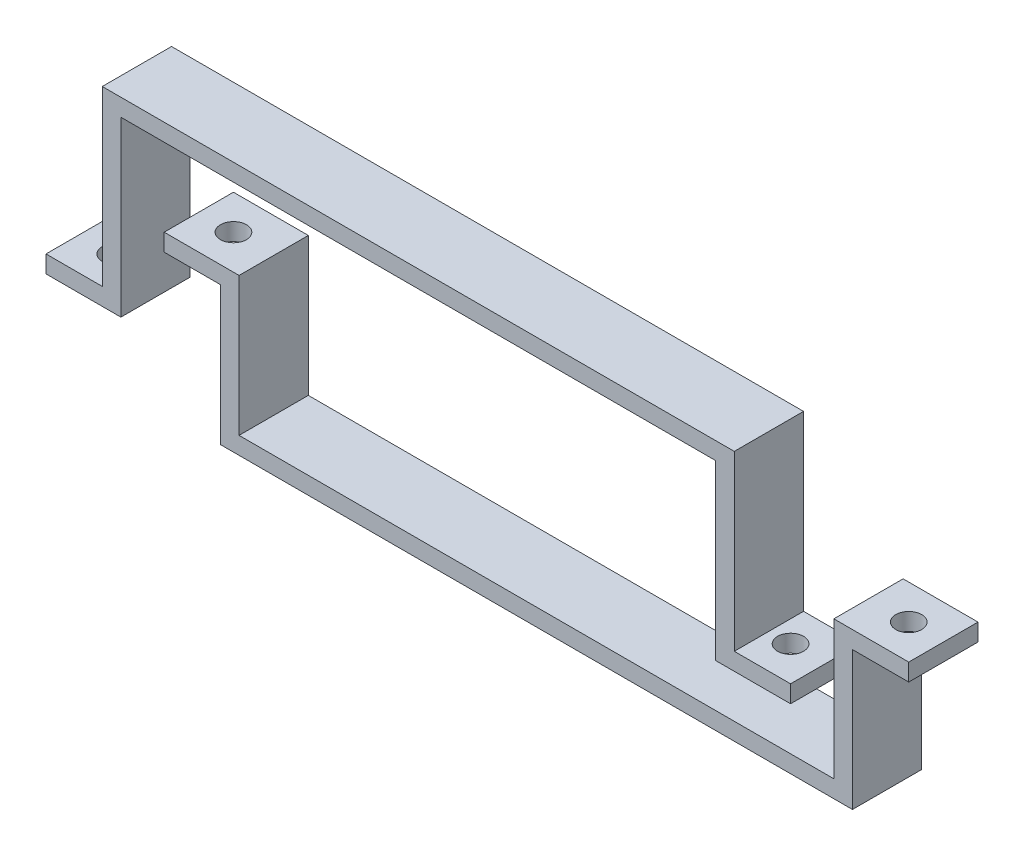
ISO-10303-21;
HEADER;
FILE_DESCRIPTION(('STEP AP214'),'2;1');
FILE_NAME('part.step','',(''),(''),'','','');
FILE_SCHEMA(('AUTOMOTIVE_DESIGN { 1 0 10303 214 1 1 1 1 }'));
ENDSEC;
DATA;
#1=APPLICATION_CONTEXT('core data for automotive mechanical design processes');
#2=APPLICATION_PROTOCOL_DEFINITION('international standard','automotive_design',2000,#1);
#3=PRODUCT_CONTEXT('',#1,'mechanical');
#4=PRODUCT('Part','Part','',(#3));
#5=PRODUCT_RELATED_PRODUCT_CATEGORY('part','',(#4));
#6=PRODUCT_DEFINITION_FORMATION('','',#4);
#7=PRODUCT_DEFINITION_CONTEXT('part definition',#1,'design');
#8=PRODUCT_DEFINITION('design','',#6,#7);
#9=PRODUCT_DEFINITION_SHAPE('','',#8);
#10=(LENGTH_UNIT() NAMED_UNIT(*) SI_UNIT(.MILLI.,.METRE.));
#11=(NAMED_UNIT(*) PLANE_ANGLE_UNIT() SI_UNIT($,.RADIAN.));
#12=(NAMED_UNIT(*) SI_UNIT($,.STERADIAN.) SOLID_ANGLE_UNIT());
#13=UNCERTAINTY_MEASURE_WITH_UNIT(LENGTH_MEASURE(1.E-05),#10,'distance_accuracy_value','');
#14=(GEOMETRIC_REPRESENTATION_CONTEXT(3) GLOBAL_UNCERTAINTY_ASSIGNED_CONTEXT((#13)) GLOBAL_UNIT_ASSIGNED_CONTEXT((#10,
#11,#12)) REPRESENTATION_CONTEXT('',''));
#15=CARTESIAN_POINT('',(0.,0.,0.));
#16=DIRECTION('',(0.,0.,1.));
#17=DIRECTION('',(1.,0.,0.));
#18=AXIS2_PLACEMENT_3D('',#15,#16,#17);
#19=CARTESIAN_POINT('',(-8.42045299834451,9.22574823310614,93.7490792128662));
#20=DIRECTION('',(0.,-1.,0.));
#21=DIRECTION('',(0.,0.,-1.));
#22=AXIS2_PLACEMENT_3D('',#19,#20,#21);
#23=PLANE('',#22);
#24=DIRECTION('',(1.,0.,0.));
#25=VECTOR('',#24,1.);
#26=CARTESIAN_POINT('',(-44.9204529983445,9.22574823310614,89.7490792128662));
#27=LINE('',#26,#25);
#28=CARTESIAN_POINT('',(-42.7704529983445,9.22574823310614,89.7490792128662));
#29=VERTEX_POINT('',#28);
#30=CARTESIAN_POINT('',(25.9295470016555,9.22574823310614,89.7490792128662));
#31=VERTEX_POINT('',#30);
#32=EDGE_CURVE('P0_E193',#29,#31,#27,.T.);
#33=ORIENTED_EDGE('',*,*,#32,.T.);
#34=DIRECTION('',(0.,0.,-1.));
#35=VECTOR('',#34,1.);
#36=CARTESIAN_POINT('',(25.9295470016555,9.22574823310614,93.7490792128662));
#37=LINE('',#36,#35);
#38=CARTESIAN_POINT('',(25.9295470016555,9.22574823310614,97.7490792128662));
#39=VERTEX_POINT('',#38);
#40=EDGE_CURVE('P0_E163',#39,#31,#37,.T.);
#41=ORIENTED_EDGE('',*,*,#40,.F.);
#42=DIRECTION('',(1.,0.,0.));
#43=VECTOR('',#42,1.);
#44=CARTESIAN_POINT('',(-44.9204529983445,9.22574823310614,97.7490792128662));
#45=LINE('',#44,#43);
#46=CARTESIAN_POINT('',(-42.7704529983445,9.22574823310614,97.7490792128662));
#47=VERTEX_POINT('',#46);
#48=EDGE_CURVE('P0_E200',#47,#39,#45,.T.);
#49=ORIENTED_EDGE('',*,*,#48,.F.);
#50=DIRECTION('',(0.,0.,1.));
#51=VECTOR('',#50,1.);
#52=CARTESIAN_POINT('',(-42.7704529983445,9.22574823310614,93.7490792128662));
#53=LINE('',#52,#51);
#54=EDGE_CURVE('P0_E178',#29,#47,#53,.T.);
#55=ORIENTED_EDGE('',*,*,#54,.F.);
#56=EDGE_LOOP('',(#33,#41,#49,#55));
#57=FACE_BOUND('',#56,.T.);
#58=ADVANCED_FACE('P0_F17',(#57),#23,.T.);
#59=CARTESIAN_POINT('',(-44.9204529983445,11.2257482331061,97.7490792128662));
#60=DIRECTION('',(-1.,0.,0.));
#61=DIRECTION('',(0.,0.,1.));
#62=AXIS2_PLACEMENT_3D('',#59,#60,#61);
#63=PLANE('',#62);
#64=DIRECTION('',(0.,0.,-1.));
#65=VECTOR('',#64,1.);
#66=CARTESIAN_POINT('',(-44.9204529983445,-8.77425176689386,93.7490792128662));
#67=LINE('',#66,#65);
#68=CARTESIAN_POINT('',(-44.9204529983445,-8.77425176689386,97.7490792128662));
#69=VERTEX_POINT('',#68);
#70=CARTESIAN_POINT('',(-44.9204529983445,-8.77425176689386,89.7490792128662));
#71=VERTEX_POINT('',#70);
#72=EDGE_CURVE('P0_E42',#69,#71,#67,.T.);
#73=ORIENTED_EDGE('',*,*,#72,.F.);
#74=DIRECTION('',(0.,-1.,0.));
#75=VECTOR('',#74,1.);
#76=CARTESIAN_POINT('',(-44.9204529983445,11.2257482331061,97.7490792128662));
#77=LINE('',#76,#75);
#78=CARTESIAN_POINT('',(-44.9204529983445,11.2257482331061,97.7490792128662));
#79=VERTEX_POINT('',#78);
#80=EDGE_CURVE('P0_E11',#79,#69,#77,.T.);
#81=ORIENTED_EDGE('',*,*,#80,.F.);
#82=DIRECTION('',(0.,0.,-1.));
#83=VECTOR('',#82,1.);
#84=CARTESIAN_POINT('',(-44.9204529983445,11.2257482331061,97.7490792128662));
#85=LINE('',#84,#83);
#86=CARTESIAN_POINT('',(-44.9204529983445,11.2257482331061,89.7490792128662));
#87=VERTEX_POINT('',#86);
#88=EDGE_CURVE('P0_E196',#79,#87,#85,.T.);
#89=ORIENTED_EDGE('',*,*,#88,.T.);
#90=DIRECTION('',(0.,-1.,0.));
#91=VECTOR('',#90,1.);
#92=CARTESIAN_POINT('',(-44.9204529983445,11.2257482331061,89.7490792128662));
#93=LINE('',#92,#91);
#94=EDGE_CURVE('P0_E21',#87,#71,#93,.T.);
#95=ORIENTED_EDGE('',*,*,#94,.T.);
#96=EDGE_LOOP('',(#73,#81,#89,#95));
#97=FACE_BOUND('',#96,.T.);
#98=ADVANCED_FACE('P0_F19',(#97),#63,.T.);
#99=CARTESIAN_POINT('',(-44.9204529983445,11.2257482331061,97.7490792128662));
#100=DIRECTION('',(0.,0.,-1.));
#101=DIRECTION('',(-1.,0.,0.));
#102=AXIS2_PLACEMENT_3D('',#99,#100,#101);
#103=PLANE('',#102);
#104=ORIENTED_EDGE('',*,*,#80,.T.);
#105=DIRECTION('',(1.,0.,0.));
#106=VECTOR('',#105,1.);
#107=CARTESIAN_POINT('',(-8.42045299834451,-8.77425176689386,97.7490792128662));
#108=LINE('',#107,#106);
#109=CARTESIAN_POINT('',(-51.4204529983445,-8.77425176689386,97.7490792128662));
#110=VERTEX_POINT('',#109);
#111=EDGE_CURVE('P0_E152',#110,#69,#108,.T.);
#112=ORIENTED_EDGE('',*,*,#111,.F.);
#113=DIRECTION('',(0.,-1.,0.));
#114=VECTOR('',#113,1.);
#115=CARTESIAN_POINT('',(-51.4204529983445,-8.77425176689386,97.7490792128662));
#116=LINE('',#115,#114);
#117=CARTESIAN_POINT('',(-51.4204529983445,-10.7742517668939,97.7490792128662));
#118=VERTEX_POINT('',#117);
#119=EDGE_CURVE('P0_E157',#110,#118,#116,.T.);
#120=ORIENTED_EDGE('',*,*,#119,.T.);
#121=DIRECTION('',(1.,0.,0.));
#122=VECTOR('',#121,1.);
#123=CARTESIAN_POINT('',(-8.42045299834451,-10.7742517668939,97.7490792128662));
#124=LINE('',#123,#122);
#125=CARTESIAN_POINT('',(-42.7704529983445,-10.7742517668939,97.7490792128662));
#126=VERTEX_POINT('',#125);
#127=EDGE_CURVE('P0_E184',#118,#126,#124,.T.);
#128=ORIENTED_EDGE('',*,*,#127,.T.);
#129=DIRECTION('',(0.,1.,0.));
#130=VECTOR('',#129,1.);
#131=CARTESIAN_POINT('',(-42.7704529983445,-10.7742517668939,97.7490792128662));
#132=LINE('',#131,#130);
#133=EDGE_CURVE('P0_E190',#126,#47,#132,.T.);
#134=ORIENTED_EDGE('',*,*,#133,.T.);
#135=ORIENTED_EDGE('',*,*,#48,.T.);
#136=DIRECTION('',(0.,1.,0.));
#137=VECTOR('',#136,1.);
#138=CARTESIAN_POINT('',(25.9295470016555,-10.7742517668939,97.7490792128662));
#139=LINE('',#138,#137);
#140=CARTESIAN_POINT('',(25.9295470016555,-10.7742517668939,97.7490792128662));
#141=VERTEX_POINT('',#140);
#142=EDGE_CURVE('P0_E173',#141,#39,#139,.T.);
#143=ORIENTED_EDGE('',*,*,#142,.F.);
#144=DIRECTION('',(1.,0.,0.));
#145=VECTOR('',#144,1.);
#146=CARTESIAN_POINT('',(-8.42045299834451,-10.7742517668939,97.7490792128662));
#147=LINE('',#146,#145);
#148=CARTESIAN_POINT('',(34.5795470016555,-10.7742517668939,97.7490792128662));
#149=VERTEX_POINT('',#148);
#150=EDGE_CURVE('P0_E169',#141,#149,#147,.T.);
#151=ORIENTED_EDGE('',*,*,#150,.T.);
#152=DIRECTION('',(0.,-1.,0.));
#153=VECTOR('',#152,1.);
#154=CARTESIAN_POINT('',(34.5795470016555,-8.77425176689386,97.7490792128662));
#155=LINE('',#154,#153);
#156=CARTESIAN_POINT('',(34.5795470016555,-8.77425176689386,97.7490792128662));
#157=VERTEX_POINT('',#156);
#158=EDGE_CURVE('P0_E122',#157,#149,#155,.T.);
#159=ORIENTED_EDGE('',*,*,#158,.F.);
#160=DIRECTION('',(1.,0.,0.));
#161=VECTOR('',#160,1.);
#162=CARTESIAN_POINT('',(-8.42045299834451,-8.77425176689386,97.7490792128662));
#163=LINE('',#162,#161);
#164=CARTESIAN_POINT('',(28.0795470016555,-8.77425176689386,97.7490792128662));
#165=VERTEX_POINT('',#164);
#166=EDGE_CURVE('P0_E110',#165,#157,#163,.T.);
#167=ORIENTED_EDGE('',*,*,#166,.F.);
#168=DIRECTION('',(0.,-1.,0.));
#169=VECTOR('',#168,1.);
#170=CARTESIAN_POINT('',(28.0795470016555,11.2257482331061,97.7490792128662));
#171=LINE('',#170,#169);
#172=CARTESIAN_POINT('',(28.0795470016555,11.2257482331061,97.7490792128662));
#173=VERTEX_POINT('',#172);
#174=EDGE_CURVE('P0_E26',#173,#165,#171,.T.);
#175=ORIENTED_EDGE('',*,*,#174,.F.);
#176=DIRECTION('',(1.,0.,0.));
#177=VECTOR('',#176,1.);
#178=CARTESIAN_POINT('',(-44.9204529983445,11.2257482331061,97.7490792128662));
#179=LINE('',#178,#177);
#180=EDGE_CURVE('P0_E204',#79,#173,#179,.T.);
#181=ORIENTED_EDGE('',*,*,#180,.F.);
#182=EDGE_LOOP('',(#104,#112,#120,#128,#134,#135,#143,#151,#159,#167,#175,#181));
#183=FACE_BOUND('',#182,.T.);
#184=ADVANCED_FACE('P0_F225',(#183),#103,.F.);
#185=CARTESIAN_POINT('',(28.0795470016555,11.2257482331061,97.7490792128662));
#186=DIRECTION('',(-1.,0.,0.));
#187=DIRECTION('',(0.,0.,1.));
#188=AXIS2_PLACEMENT_3D('',#185,#186,#187);
#189=PLANE('',#188);
#190=ORIENTED_EDGE('',*,*,#174,.T.);
#191=DIRECTION('',(0.,0.,-1.));
#192=VECTOR('',#191,1.);
#193=CARTESIAN_POINT('',(28.0795470016555,-8.77425176689386,93.7490792128662));
#194=LINE('',#193,#192);
#195=CARTESIAN_POINT('',(28.0795470016555,-8.77425176689386,89.7490792128662));
#196=VERTEX_POINT('',#195);
#197=EDGE_CURVE('P0_E123',#165,#196,#194,.T.);
#198=ORIENTED_EDGE('',*,*,#197,.T.);
#199=DIRECTION('',(0.,-1.,0.));
#200=VECTOR('',#199,1.);
#201=CARTESIAN_POINT('',(28.0795470016555,11.2257482331061,89.7490792128662));
#202=LINE('',#201,#200);
#203=CARTESIAN_POINT('',(28.0795470016555,11.2257482331061,89.7490792128662));
#204=VERTEX_POINT('',#203);
#205=EDGE_CURVE('P0_E130',#204,#196,#202,.T.);
#206=ORIENTED_EDGE('',*,*,#205,.F.);
#207=DIRECTION('',(0.,0.,-1.));
#208=VECTOR('',#207,1.);
#209=CARTESIAN_POINT('',(28.0795470016555,11.2257482331061,97.7490792128662));
#210=LINE('',#209,#208);
#211=EDGE_CURVE('P0_E202',#173,#204,#210,.T.);
#212=ORIENTED_EDGE('',*,*,#211,.F.);
#213=EDGE_LOOP('',(#190,#198,#206,#212));
#214=FACE_BOUND('',#213,.T.);
#215=ADVANCED_FACE('P0_F232',(#214),#189,.F.);
#216=CARTESIAN_POINT('',(-44.9204529983445,11.2257482331061,89.7490792128662));
#217=DIRECTION('',(0.,0.,-1.));
#218=DIRECTION('',(-1.,0.,0.));
#219=AXIS2_PLACEMENT_3D('',#216,#217,#218);
#220=PLANE('',#219);
#221=ORIENTED_EDGE('',*,*,#32,.F.);
#222=DIRECTION('',(0.,1.,0.));
#223=VECTOR('',#222,1.);
#224=CARTESIAN_POINT('',(-42.7704529983445,-10.7742517668939,89.7490792128662));
#225=LINE('',#224,#223);
#226=CARTESIAN_POINT('',(-42.7704529983445,-10.7742517668939,89.7490792128662));
#227=VERTEX_POINT('',#226);
#228=EDGE_CURVE('P0_E187',#227,#29,#225,.T.);
#229=ORIENTED_EDGE('',*,*,#228,.F.);
#230=DIRECTION('',(1.,0.,0.));
#231=VECTOR('',#230,1.);
#232=CARTESIAN_POINT('',(-8.42045299834451,-10.7742517668939,89.7490792128662));
#233=LINE('',#232,#231);
#234=CARTESIAN_POINT('',(-51.4204529983445,-10.7742517668939,89.7490792128662));
#235=VERTEX_POINT('',#234);
#236=EDGE_CURVE('P0_E182',#235,#227,#233,.T.);
#237=ORIENTED_EDGE('',*,*,#236,.F.);
#238=DIRECTION('',(0.,-1.,0.));
#239=VECTOR('',#238,1.);
#240=CARTESIAN_POINT('',(-51.4204529983445,-8.77425176689386,89.7490792128662));
#241=LINE('',#240,#239);
#242=CARTESIAN_POINT('',(-51.4204529983445,-8.77425176689386,89.7490792128662));
#243=VERTEX_POINT('',#242);
#244=EDGE_CURVE('P0_E160',#243,#235,#241,.T.);
#245=ORIENTED_EDGE('',*,*,#244,.F.);
#246=DIRECTION('',(1.,0.,0.));
#247=VECTOR('',#246,1.);
#248=CARTESIAN_POINT('',(-8.42045299834451,-8.77425176689386,89.7490792128662));
#249=LINE('',#248,#247);
#250=EDGE_CURVE('P0_E148',#243,#71,#249,.T.);
#251=ORIENTED_EDGE('',*,*,#250,.T.);
#252=ORIENTED_EDGE('',*,*,#94,.F.);
#253=DIRECTION('',(1.,0.,0.));
#254=VECTOR('',#253,1.);
#255=CARTESIAN_POINT('',(-44.9204529983445,11.2257482331061,89.7490792128662));
#256=LINE('',#255,#254);
#257=EDGE_CURVE('P0_E199',#87,#204,#256,.T.);
#258=ORIENTED_EDGE('',*,*,#257,.T.);
#259=ORIENTED_EDGE('',*,*,#205,.T.);
#260=DIRECTION('',(1.,0.,0.));
#261=VECTOR('',#260,1.);
#262=CARTESIAN_POINT('',(-8.42045299834451,-8.77425176689386,89.7490792128662));
#263=LINE('',#262,#261);
#264=CARTESIAN_POINT('',(34.5795470016555,-8.77425176689386,89.7490792128662));
#265=VERTEX_POINT('',#264);
#266=EDGE_CURVE('P0_E34',#196,#265,#263,.T.);
#267=ORIENTED_EDGE('',*,*,#266,.T.);
#268=DIRECTION('',(0.,-1.,0.));
#269=VECTOR('',#268,1.);
#270=CARTESIAN_POINT('',(34.5795470016555,-8.77425176689386,89.7490792128662));
#271=LINE('',#270,#269);
#272=CARTESIAN_POINT('',(34.5795470016555,-10.7742517668939,89.7490792128662));
#273=VERTEX_POINT('',#272);
#274=EDGE_CURVE('P0_E117',#265,#273,#271,.T.);
#275=ORIENTED_EDGE('',*,*,#274,.T.);
#276=DIRECTION('',(1.,0.,0.));
#277=VECTOR('',#276,1.);
#278=CARTESIAN_POINT('',(-8.42045299834451,-10.7742517668939,89.7490792128662));
#279=LINE('',#278,#277);
#280=CARTESIAN_POINT('',(25.9295470016555,-10.7742517668939,89.7490792128662));
#281=VERTEX_POINT('',#280);
#282=EDGE_CURVE('P0_E171',#281,#273,#279,.T.);
#283=ORIENTED_EDGE('',*,*,#282,.F.);
#284=DIRECTION('',(0.,1.,0.));
#285=VECTOR('',#284,1.);
#286=CARTESIAN_POINT('',(25.9295470016555,-10.7742517668939,89.7490792128662));
#287=LINE('',#286,#285);
#288=EDGE_CURVE('P0_E176',#281,#31,#287,.T.);
#289=ORIENTED_EDGE('',*,*,#288,.T.);
#290=EDGE_LOOP('',(#221,#229,#237,#245,#251,#252,#258,#259,#267,#275,#283,#289));
#291=FACE_BOUND('',#290,.T.);
#292=ADVANCED_FACE('P0_F127',(#291),#220,.T.);
#293=CARTESIAN_POINT('',(-8.42045299834451,11.2257482331061,93.7490792128662));
#294=DIRECTION('',(0.,-1.,0.));
#295=DIRECTION('',(0.,0.,-1.));
#296=AXIS2_PLACEMENT_3D('',#293,#294,#295);
#297=PLANE('',#296);
#298=ORIENTED_EDGE('',*,*,#88,.F.);
#299=ORIENTED_EDGE('',*,*,#180,.T.);
#300=ORIENTED_EDGE('',*,*,#211,.T.);
#301=ORIENTED_EDGE('',*,*,#257,.F.);
#302=EDGE_LOOP('',(#298,#299,#300,#301));
#303=FACE_BOUND('',#302,.T.);
#304=ADVANCED_FACE('P0_F230',(#303),#297,.F.);
#305=CARTESIAN_POINT('',(-42.7704529983445,-10.7742517668939,93.7490792128662));
#306=DIRECTION('',(-1.,0.,0.));
#307=DIRECTION('',(0.,0.,1.));
#308=AXIS2_PLACEMENT_3D('',#305,#306,#307);
#309=PLANE('',#308);
#310=ORIENTED_EDGE('',*,*,#54,.T.);
#311=ORIENTED_EDGE('',*,*,#133,.F.);
#312=DIRECTION('',(0.,0.,1.));
#313=VECTOR('',#312,1.);
#314=CARTESIAN_POINT('',(-42.7704529983445,-10.7742517668939,93.7490792128662));
#315=LINE('',#314,#313);
#316=EDGE_CURVE('P0_E180',#227,#126,#315,.T.);
#317=ORIENTED_EDGE('',*,*,#316,.F.);
#318=ORIENTED_EDGE('',*,*,#228,.T.);
#319=EDGE_LOOP('',(#310,#311,#317,#318));
#320=FACE_BOUND('',#319,.T.);
#321=ADVANCED_FACE('P0_F250',(#320),#309,.F.);
#322=CARTESIAN_POINT('',(-8.42045299834451,-10.7742517668939,93.7490792128662));
#323=DIRECTION('',(0.,1.,0.));
#324=DIRECTION('',(0.,0.,1.));
#325=AXIS2_PLACEMENT_3D('',#322,#323,#324);
#326=PLANE('',#325);
#327=ORIENTED_EDGE('',*,*,#316,.T.);
#328=ORIENTED_EDGE('',*,*,#127,.F.);
#329=DIRECTION('',(0.,0.,1.));
#330=VECTOR('',#329,1.);
#331=CARTESIAN_POINT('',(-51.4204529983445,-10.7742517668939,93.7490792128662));
#332=LINE('',#331,#330);
#333=EDGE_CURVE('P0_E145',#235,#118,#332,.T.);
#334=ORIENTED_EDGE('',*,*,#333,.F.);
#335=ORIENTED_EDGE('',*,*,#236,.T.);
#336=EDGE_LOOP('',(#327,#328,#334,#335));
#337=FACE_BOUND('',#336,.T.);
#338=CARTESIAN_POINT('',(-47.4204529983445,-10.7742517668939,93.7490792128662));
#339=DIRECTION('',(0.,1.,0.));
#340=DIRECTION('',(0.,0.,1.));
#341=AXIS2_PLACEMENT_3D('',#338,#339,#340);
#342=CIRCLE('',#341,1.5);
#343=CARTESIAN_POINT('',(-47.4204529983445,-10.7742517668939,95.2490792128662));
#344=VERTEX_POINT('',#343);
#345=EDGE_CURVE('P0_E140',#344,#344,#342,.T.);
#346=ORIENTED_EDGE('',*,*,#345,.T.);
#347=EDGE_LOOP('',(#346));
#348=FACE_BOUND('',#347,.T.);
#349=ADVANCED_FACE('P0_F253',(#337,#348),#326,.F.);
#350=CARTESIAN_POINT('',(25.9295470016555,-10.7742517668939,93.7490792128662));
#351=DIRECTION('',(1.,0.,0.));
#352=DIRECTION('',(0.,0.,-1.));
#353=AXIS2_PLACEMENT_3D('',#350,#351,#352);
#354=PLANE('',#353);
#355=ORIENTED_EDGE('',*,*,#40,.T.);
#356=ORIENTED_EDGE('',*,*,#288,.F.);
#357=DIRECTION('',(0.,0.,-1.));
#358=VECTOR('',#357,1.);
#359=CARTESIAN_POINT('',(25.9295470016555,-10.7742517668939,93.7490792128662));
#360=LINE('',#359,#358);
#361=EDGE_CURVE('P0_E166',#141,#281,#360,.T.);
#362=ORIENTED_EDGE('',*,*,#361,.F.);
#363=ORIENTED_EDGE('',*,*,#142,.T.);
#364=EDGE_LOOP('',(#355,#356,#362,#363));
#365=FACE_BOUND('',#364,.T.);
#366=ADVANCED_FACE('P0_F257',(#365),#354,.F.);
#367=CARTESIAN_POINT('',(-8.42045299834451,-10.7742517668939,93.7490792128662));
#368=DIRECTION('',(0.,1.,0.));
#369=DIRECTION('',(0.,0.,1.));
#370=AXIS2_PLACEMENT_3D('',#367,#368,#369);
#371=PLANE('',#370);
#372=ORIENTED_EDGE('',*,*,#361,.T.);
#373=ORIENTED_EDGE('',*,*,#282,.T.);
#374=DIRECTION('',(0.,0.,-1.));
#375=VECTOR('',#374,1.);
#376=CARTESIAN_POINT('',(34.5795470016555,-10.7742517668939,93.7490792128662));
#377=LINE('',#376,#375);
#378=EDGE_CURVE('P0_E120',#149,#273,#377,.T.);
#379=ORIENTED_EDGE('',*,*,#378,.F.);
#380=ORIENTED_EDGE('',*,*,#150,.F.);
#381=EDGE_LOOP('',(#372,#373,#379,#380));
#382=FACE_BOUND('',#381,.T.);
#383=CARTESIAN_POINT('',(30.5795470016555,-10.7742517668939,93.7490792128662));
#384=DIRECTION('',(0.,1.,0.));
#385=DIRECTION('',(0.,0.,1.));
#386=AXIS2_PLACEMENT_3D('',#383,#384,#385);
#387=CIRCLE('',#386,1.5);
#388=CARTESIAN_POINT('',(30.5795470016555,-10.7742517668939,95.2490792128662));
#389=VERTEX_POINT('',#388);
#390=EDGE_CURVE('P0_E135',#389,#389,#387,.T.);
#391=ORIENTED_EDGE('',*,*,#390,.T.);
#392=EDGE_LOOP('',(#391));
#393=FACE_BOUND('',#392,.T.);
#394=ADVANCED_FACE('P0_F261',(#382,#393),#371,.F.);
#395=CARTESIAN_POINT('',(-8.42045299834451,-8.77425176689386,93.7490792128662));
#396=DIRECTION('',(0.,1.,0.));
#397=DIRECTION('',(0.,0.,1.));
#398=AXIS2_PLACEMENT_3D('',#395,#396,#397);
#399=PLANE('',#398);
#400=ORIENTED_EDGE('',*,*,#250,.F.);
#401=DIRECTION('',(0.,0.,1.));
#402=VECTOR('',#401,1.);
#403=CARTESIAN_POINT('',(-51.4204529983445,-8.77425176689386,93.7490792128662));
#404=LINE('',#403,#402);
#405=EDGE_CURVE('P0_E155',#243,#110,#404,.T.);
#406=ORIENTED_EDGE('',*,*,#405,.T.);
#407=ORIENTED_EDGE('',*,*,#111,.T.);
#408=ORIENTED_EDGE('',*,*,#72,.T.);
#409=EDGE_LOOP('',(#400,#406,#407,#408));
#410=FACE_BOUND('',#409,.T.);
#411=CARTESIAN_POINT('',(-47.4204529983445,-8.77425176689386,93.7490792128662));
#412=DIRECTION('',(0.,1.,0.));
#413=DIRECTION('',(0.,0.,1.));
#414=AXIS2_PLACEMENT_3D('',#411,#412,#413);
#415=CIRCLE('',#414,1.5);
#416=CARTESIAN_POINT('',(-47.4204529983445,-8.77425176689386,95.2490792128662));
#417=VERTEX_POINT('',#416);
#418=EDGE_CURVE('P0_E142',#417,#417,#415,.T.);
#419=ORIENTED_EDGE('',*,*,#418,.F.);
#420=EDGE_LOOP('',(#419));
#421=FACE_BOUND('',#420,.T.);
#422=ADVANCED_FACE('P0_F215',(#410,#421),#399,.T.);
#423=CARTESIAN_POINT('',(-51.4204529983445,-8.77425176689386,93.7490792128662));
#424=DIRECTION('',(1.,0.,0.));
#425=DIRECTION('',(0.,0.,-1.));
#426=AXIS2_PLACEMENT_3D('',#423,#424,#425);
#427=PLANE('',#426);
#428=ORIENTED_EDGE('',*,*,#333,.T.);
#429=ORIENTED_EDGE('',*,*,#119,.F.);
#430=ORIENTED_EDGE('',*,*,#405,.F.);
#431=ORIENTED_EDGE('',*,*,#244,.T.);
#432=EDGE_LOOP('',(#428,#429,#430,#431));
#433=FACE_BOUND('',#432,.T.);
#434=ADVANCED_FACE('P0_F223',(#433),#427,.F.);
#435=CARTESIAN_POINT('',(-47.4204529983445,-8.77425176689386,93.7490792128662));
#436=DIRECTION('',(0.,-1.,0.));
#437=DIRECTION('',(0.,0.,-1.));
#438=AXIS2_PLACEMENT_3D('',#435,#436,#437);
#439=CYLINDRICAL_SURFACE('',#438,1.5);
#440=ORIENTED_EDGE('',*,*,#418,.T.);
#441=EDGE_LOOP('',(#440));
#442=FACE_BOUND('',#441,.T.);
#443=ORIENTED_EDGE('',*,*,#345,.F.);
#444=EDGE_LOOP('',(#443));
#445=FACE_BOUND('',#444,.T.);
#446=ADVANCED_FACE('P0_F268',(#442,#445),#439,.F.);
#447=CARTESIAN_POINT('',(-8.42045299834451,-8.77425176689386,93.7490792128662));
#448=DIRECTION('',(0.,1.,0.));
#449=DIRECTION('',(0.,0.,1.));
#450=AXIS2_PLACEMENT_3D('',#447,#448,#449);
#451=PLANE('',#450);
#452=ORIENTED_EDGE('',*,*,#266,.F.);
#453=ORIENTED_EDGE('',*,*,#197,.F.);
#454=ORIENTED_EDGE('',*,*,#166,.T.);
#455=DIRECTION('',(0.,0.,-1.));
#456=VECTOR('',#455,1.);
#457=CARTESIAN_POINT('',(34.5795470016555,-8.77425176689386,93.7490792128662));
#458=LINE('',#457,#456);
#459=EDGE_CURVE('P0_E106',#157,#265,#458,.T.);
#460=ORIENTED_EDGE('',*,*,#459,.T.);
#461=EDGE_LOOP('',(#452,#453,#454,#460));
#462=FACE_BOUND('',#461,.T.);
#463=CARTESIAN_POINT('',(30.5795470016555,-8.77425176689386,93.7490792128662));
#464=DIRECTION('',(0.,1.,0.));
#465=DIRECTION('',(0.,0.,1.));
#466=AXIS2_PLACEMENT_3D('',#463,#464,#465);
#467=CIRCLE('',#466,1.5);
#468=CARTESIAN_POINT('',(30.5795470016555,-8.77425176689386,95.2490792128662));
#469=VERTEX_POINT('',#468);
#470=EDGE_CURVE('P0_E132',#469,#469,#467,.T.);
#471=ORIENTED_EDGE('',*,*,#470,.F.);
#472=EDGE_LOOP('',(#471));
#473=FACE_BOUND('',#472,.T.);
#474=ADVANCED_FACE('P0_F108',(#462,#473),#451,.T.);
#475=CARTESIAN_POINT('',(34.5795470016555,-8.77425176689386,93.7490792128662));
#476=DIRECTION('',(-1.,0.,0.));
#477=DIRECTION('',(0.,0.,1.));
#478=AXIS2_PLACEMENT_3D('',#475,#476,#477);
#479=PLANE('',#478);
#480=ORIENTED_EDGE('',*,*,#378,.T.);
#481=ORIENTED_EDGE('',*,*,#274,.F.);
#482=ORIENTED_EDGE('',*,*,#459,.F.);
#483=ORIENTED_EDGE('',*,*,#158,.T.);
#484=EDGE_LOOP('',(#480,#481,#482,#483));
#485=FACE_BOUND('',#484,.T.);
#486=ADVANCED_FACE('P0_F118',(#485),#479,.F.);
#487=CARTESIAN_POINT('',(30.5795470016555,-8.77425176689386,93.7490792128662));
#488=DIRECTION('',(0.,-1.,0.));
#489=DIRECTION('',(0.,0.,-1.));
#490=AXIS2_PLACEMENT_3D('',#487,#488,#489);
#491=CYLINDRICAL_SURFACE('',#490,1.5);
#492=ORIENTED_EDGE('',*,*,#470,.T.);
#493=EDGE_LOOP('',(#492));
#494=FACE_BOUND('',#493,.T.);
#495=ORIENTED_EDGE('',*,*,#390,.F.);
#496=EDGE_LOOP('',(#495));
#497=FACE_BOUND('',#496,.T.);
#498=ADVANCED_FACE('P0_F276',(#494,#497),#491,.F.);
#499=CLOSED_SHELL('',(#58,#98,#184,#215,#292,#304,#321,#349,#366,#394,#422,#434,#446,#474,#486,#498));
#500=MANIFOLD_SOLID_BREP('P0_B1',#499);
#501=CARTESIAN_POINT('',(5.22954700165548,-15.7742517668939,93.7490792128662));
#502=DIRECTION('',(0.,1.,0.));
#503=DIRECTION('',(0.,0.,1.));
#504=AXIS2_PLACEMENT_3D('',#501,#502,#503);
#505=PLANE('',#504);
#506=DIRECTION('',(1.,0.,0.));
#507=VECTOR('',#506,1.);
#508=CARTESIAN_POINT('',(-31.2704529983445,-15.7742517668939,97.7490792128662));
#509=LINE('',#508,#507);
#510=CARTESIAN_POINT('',(-29.1204529983445,-15.7742517668939,97.7490792128662));
#511=VERTEX_POINT('',#510);
#512=CARTESIAN_POINT('',(39.5795470016555,-15.7742517668939,97.7490792128662));
#513=VERTEX_POINT('',#512);
#514=EDGE_CURVE('P1_E192',#511,#513,#509,.T.);
#515=ORIENTED_EDGE('',*,*,#514,.T.);
#516=DIRECTION('',(0.,0.,1.));
#517=VECTOR('',#516,1.);
#518=CARTESIAN_POINT('',(39.5795470016555,-15.7742517668939,93.7490792128662));
#519=LINE('',#518,#517);
#520=CARTESIAN_POINT('',(39.5795470016555,-15.7742517668939,89.7490792128662));
#521=VERTEX_POINT('',#520);
#522=EDGE_CURVE('P1_E162',#521,#513,#519,.T.);
#523=ORIENTED_EDGE('',*,*,#522,.F.);
#524=DIRECTION('',(1.,0.,0.));
#525=VECTOR('',#524,1.);
#526=CARTESIAN_POINT('',(-31.2704529983445,-15.7742517668939,89.7490792128662));
#527=LINE('',#526,#525);
#528=CARTESIAN_POINT('',(-29.1204529983445,-15.7742517668939,89.7490792128662));
#529=VERTEX_POINT('',#528);
#530=EDGE_CURVE('P1_E199',#529,#521,#527,.T.);
#531=ORIENTED_EDGE('',*,*,#530,.F.);
#532=DIRECTION('',(0.,0.,-1.));
#533=VECTOR('',#532,1.);
#534=CARTESIAN_POINT('',(-29.1204529983445,-15.7742517668939,93.7490792128662));
#535=LINE('',#534,#533);
#536=EDGE_CURVE('P1_E177',#511,#529,#535,.T.);
#537=ORIENTED_EDGE('',*,*,#536,.F.);
#538=EDGE_LOOP('',(#515,#523,#531,#537));
#539=FACE_BOUND('',#538,.T.);
#540=ADVANCED_FACE('P1_F16',(#539),#505,.T.);
#541=CARTESIAN_POINT('',(-31.2704529983445,-17.7742517668939,89.7490792128662));
#542=DIRECTION('',(-1.,0.,0.));
#543=DIRECTION('',(0.,0.,-1.));
#544=AXIS2_PLACEMENT_3D('',#541,#542,#543);
#545=PLANE('',#544);
#546=DIRECTION('',(0.,0.,1.));
#547=VECTOR('',#546,1.);
#548=CARTESIAN_POINT('',(-31.2704529983445,-1.77425176689386,93.7490792128662));
#549=LINE('',#548,#547);
#550=CARTESIAN_POINT('',(-31.2704529983445,-1.77425176689386,89.7490792128662));
#551=VERTEX_POINT('',#550);
#552=CARTESIAN_POINT('',(-31.2704529983445,-1.77425176689386,97.7490792128662));
#553=VERTEX_POINT('',#552);
#554=EDGE_CURVE('P1_E41',#551,#553,#549,.T.);
#555=ORIENTED_EDGE('',*,*,#554,.F.);
#556=DIRECTION('',(0.,1.,0.));
#557=VECTOR('',#556,1.);
#558=CARTESIAN_POINT('',(-31.2704529983445,-17.7742517668939,89.7490792128662));
#559=LINE('',#558,#557);
#560=CARTESIAN_POINT('',(-31.2704529983445,-17.7742517668939,89.7490792128662));
#561=VERTEX_POINT('',#560);
#562=EDGE_CURVE('P1_E10',#561,#551,#559,.T.);
#563=ORIENTED_EDGE('',*,*,#562,.F.);
#564=DIRECTION('',(0.,0.,1.));
#565=VECTOR('',#564,1.);
#566=CARTESIAN_POINT('',(-31.2704529983445,-17.7742517668939,89.7490792128662));
#567=LINE('',#566,#565);
#568=CARTESIAN_POINT('',(-31.2704529983445,-17.7742517668939,97.7490792128662));
#569=VERTEX_POINT('',#568);
#570=EDGE_CURVE('P1_E195',#561,#569,#567,.T.);
#571=ORIENTED_EDGE('',*,*,#570,.T.);
#572=DIRECTION('',(0.,1.,0.));
#573=VECTOR('',#572,1.);
#574=CARTESIAN_POINT('',(-31.2704529983445,-17.7742517668939,97.7490792128662));
#575=LINE('',#574,#573);
#576=EDGE_CURVE('P1_E20',#569,#553,#575,.T.);
#577=ORIENTED_EDGE('',*,*,#576,.T.);
#578=EDGE_LOOP('',(#555,#563,#571,#577));
#579=FACE_BOUND('',#578,.T.);
#580=ADVANCED_FACE('P1_F18',(#579),#545,.T.);
#581=CARTESIAN_POINT('',(-31.2704529983445,-17.7742517668939,89.7490792128662));
#582=DIRECTION('',(0.,0.,1.));
#583=DIRECTION('',(-1.,0.,0.));
#584=AXIS2_PLACEMENT_3D('',#581,#582,#583);
#585=PLANE('',#584);
#586=ORIENTED_EDGE('',*,*,#562,.T.);
#587=DIRECTION('',(1.,0.,0.));
#588=VECTOR('',#587,1.);
#589=CARTESIAN_POINT('',(5.22954700165548,-1.77425176689386,89.7490792128662));
#590=LINE('',#589,#588);
#591=CARTESIAN_POINT('',(-37.7704529983445,-1.77425176689385,89.7490792128662));
#592=VERTEX_POINT('',#591);
#593=EDGE_CURVE('P1_E151',#592,#551,#590,.T.);
#594=ORIENTED_EDGE('',*,*,#593,.F.);
#595=DIRECTION('',(0.,1.,0.));
#596=VECTOR('',#595,1.);
#597=CARTESIAN_POINT('',(-37.7704529983445,-1.77425176689385,89.7490792128662));
#598=LINE('',#597,#596);
#599=CARTESIAN_POINT('',(-37.7704529983445,0.225748233106143,89.7490792128662));
#600=VERTEX_POINT('',#599);
#601=EDGE_CURVE('P1_E156',#592,#600,#598,.T.);
#602=ORIENTED_EDGE('',*,*,#601,.T.);
#603=DIRECTION('',(1.,0.,0.));
#604=VECTOR('',#603,1.);
#605=CARTESIAN_POINT('',(5.22954700165548,0.22574823310614,89.7490792128662));
#606=LINE('',#605,#604);
#607=CARTESIAN_POINT('',(-29.1204529983445,0.225748233106143,89.7490792128662));
#608=VERTEX_POINT('',#607);
#609=EDGE_CURVE('P1_E183',#600,#608,#606,.T.);
#610=ORIENTED_EDGE('',*,*,#609,.T.);
#611=DIRECTION('',(0.,-1.,0.));
#612=VECTOR('',#611,1.);
#613=CARTESIAN_POINT('',(-29.1204529983445,0.225748233106143,89.7490792128662));
#614=LINE('',#613,#612);
#615=EDGE_CURVE('P1_E189',#608,#529,#614,.T.);
#616=ORIENTED_EDGE('',*,*,#615,.T.);
#617=ORIENTED_EDGE('',*,*,#530,.T.);
#618=DIRECTION('',(0.,-1.,0.));
#619=VECTOR('',#618,1.);
#620=CARTESIAN_POINT('',(39.5795470016555,0.225748233106136,89.7490792128662));
#621=LINE('',#620,#619);
#622=CARTESIAN_POINT('',(39.5795470016555,0.225748233106136,89.7490792128662));
#623=VERTEX_POINT('',#622);
#624=EDGE_CURVE('P1_E172',#623,#521,#621,.T.);
#625=ORIENTED_EDGE('',*,*,#624,.F.);
#626=DIRECTION('',(1.,0.,0.));
#627=VECTOR('',#626,1.);
#628=CARTESIAN_POINT('',(5.22954700165548,0.22574823310614,89.7490792128662));
#629=LINE('',#628,#627);
#630=CARTESIAN_POINT('',(48.2295470016555,0.225748233106136,89.7490792128662));
#631=VERTEX_POINT('',#630);
#632=EDGE_CURVE('P1_E168',#623,#631,#629,.T.);
#633=ORIENTED_EDGE('',*,*,#632,.T.);
#634=DIRECTION('',(0.,1.,0.));
#635=VECTOR('',#634,1.);
#636=CARTESIAN_POINT('',(48.2295470016555,-1.77425176689387,89.7490792128662));
#637=LINE('',#636,#635);
#638=CARTESIAN_POINT('',(48.2295470016555,-1.77425176689387,89.7490792128662));
#639=VERTEX_POINT('',#638);
#640=EDGE_CURVE('P1_E121',#639,#631,#637,.T.);
#641=ORIENTED_EDGE('',*,*,#640,.F.);
#642=DIRECTION('',(1.,0.,0.));
#643=VECTOR('',#642,1.);
#644=CARTESIAN_POINT('',(5.22954700165548,-1.77425176689386,89.7490792128662));
#645=LINE('',#644,#643);
#646=CARTESIAN_POINT('',(41.7295470016555,-1.77425176689386,89.7490792128662));
#647=VERTEX_POINT('',#646);
#648=EDGE_CURVE('P1_E109',#647,#639,#645,.T.);
#649=ORIENTED_EDGE('',*,*,#648,.F.);
#650=DIRECTION('',(0.,1.,0.));
#651=VECTOR('',#650,1.);
#652=CARTESIAN_POINT('',(41.7295470016555,-17.7742517668939,89.7490792128662));
#653=LINE('',#652,#651);
#654=CARTESIAN_POINT('',(41.7295470016555,-17.7742517668939,89.7490792128662));
#655=VERTEX_POINT('',#654);
#656=EDGE_CURVE('P1_E25',#655,#647,#653,.T.);
#657=ORIENTED_EDGE('',*,*,#656,.F.);
#658=DIRECTION('',(1.,0.,0.));
#659=VECTOR('',#658,1.);
#660=CARTESIAN_POINT('',(-31.2704529983445,-17.7742517668939,89.7490792128662));
#661=LINE('',#660,#659);
#662=EDGE_CURVE('P1_E203',#561,#655,#661,.T.);
#663=ORIENTED_EDGE('',*,*,#662,.F.);
#664=EDGE_LOOP('',(#586,#594,#602,#610,#616,#617,#625,#633,#641,#649,#657,#663));
#665=FACE_BOUND('',#664,.T.);
#666=ADVANCED_FACE('P1_F224',(#665),#585,.F.);
#667=CARTESIAN_POINT('',(41.7295470016555,-17.7742517668939,89.7490792128662));
#668=DIRECTION('',(-1.,0.,0.));
#669=DIRECTION('',(0.,0.,-1.));
#670=AXIS2_PLACEMENT_3D('',#667,#668,#669);
#671=PLANE('',#670);
#672=ORIENTED_EDGE('',*,*,#656,.T.);
#673=DIRECTION('',(0.,0.,1.));
#674=VECTOR('',#673,1.);
#675=CARTESIAN_POINT('',(41.7295470016555,-1.77425176689386,93.7490792128662));
#676=LINE('',#675,#674);
#677=CARTESIAN_POINT('',(41.7295470016555,-1.77425176689386,97.7490792128662));
#678=VERTEX_POINT('',#677);
#679=EDGE_CURVE('P1_E122',#647,#678,#676,.T.);
#680=ORIENTED_EDGE('',*,*,#679,.T.);
#681=DIRECTION('',(0.,1.,0.));
#682=VECTOR('',#681,1.);
#683=CARTESIAN_POINT('',(41.7295470016555,-17.7742517668939,97.7490792128662));
#684=LINE('',#683,#682);
#685=CARTESIAN_POINT('',(41.7295470016555,-17.7742517668939,97.7490792128662));
#686=VERTEX_POINT('',#685);
#687=EDGE_CURVE('P1_E129',#686,#678,#684,.T.);
#688=ORIENTED_EDGE('',*,*,#687,.F.);
#689=DIRECTION('',(0.,0.,1.));
#690=VECTOR('',#689,1.);
#691=CARTESIAN_POINT('',(41.7295470016555,-17.7742517668939,89.7490792128662));
#692=LINE('',#691,#690);
#693=EDGE_CURVE('P1_E201',#655,#686,#692,.T.);
#694=ORIENTED_EDGE('',*,*,#693,.F.);
#695=EDGE_LOOP('',(#672,#680,#688,#694));
#696=FACE_BOUND('',#695,.T.);
#697=ADVANCED_FACE('P1_F231',(#696),#671,.F.);
#698=CARTESIAN_POINT('',(-31.2704529983445,-17.7742517668939,97.7490792128662));
#699=DIRECTION('',(0.,0.,1.));
#700=DIRECTION('',(-1.,0.,0.));
#701=AXIS2_PLACEMENT_3D('',#698,#699,#700);
#702=PLANE('',#701);
#703=ORIENTED_EDGE('',*,*,#514,.F.);
#704=DIRECTION('',(0.,-1.,0.));
#705=VECTOR('',#704,1.);
#706=CARTESIAN_POINT('',(-29.1204529983445,0.225748233106143,97.7490792128662));
#707=LINE('',#706,#705);
#708=CARTESIAN_POINT('',(-29.1204529983445,0.225748233106143,97.7490792128662));
#709=VERTEX_POINT('',#708);
#710=EDGE_CURVE('P1_E186',#709,#511,#707,.T.);
#711=ORIENTED_EDGE('',*,*,#710,.F.);
#712=DIRECTION('',(1.,0.,0.));
#713=VECTOR('',#712,1.);
#714=CARTESIAN_POINT('',(5.22954700165548,0.22574823310614,97.7490792128662));
#715=LINE('',#714,#713);
#716=CARTESIAN_POINT('',(-37.7704529983445,0.225748233106143,97.7490792128662));
#717=VERTEX_POINT('',#716);
#718=EDGE_CURVE('P1_E181',#717,#709,#715,.T.);
#719=ORIENTED_EDGE('',*,*,#718,.F.);
#720=DIRECTION('',(0.,1.,0.));
#721=VECTOR('',#720,1.);
#722=CARTESIAN_POINT('',(-37.7704529983445,-1.77425176689385,97.7490792128662));
#723=LINE('',#722,#721);
#724=CARTESIAN_POINT('',(-37.7704529983445,-1.77425176689385,97.7490792128662));
#725=VERTEX_POINT('',#724);
#726=EDGE_CURVE('P1_E159',#725,#717,#723,.T.);
#727=ORIENTED_EDGE('',*,*,#726,.F.);
#728=DIRECTION('',(1.,0.,0.));
#729=VECTOR('',#728,1.);
#730=CARTESIAN_POINT('',(5.22954700165548,-1.77425176689386,97.7490792128662));
#731=LINE('',#730,#729);
#732=EDGE_CURVE('P1_E147',#725,#553,#731,.T.);
#733=ORIENTED_EDGE('',*,*,#732,.T.);
#734=ORIENTED_EDGE('',*,*,#576,.F.);
#735=DIRECTION('',(1.,0.,0.));
#736=VECTOR('',#735,1.);
#737=CARTESIAN_POINT('',(-31.2704529983445,-17.7742517668939,97.7490792128662));
#738=LINE('',#737,#736);
#739=EDGE_CURVE('P1_E198',#569,#686,#738,.T.);
#740=ORIENTED_EDGE('',*,*,#739,.T.);
#741=ORIENTED_EDGE('',*,*,#687,.T.);
#742=DIRECTION('',(1.,0.,0.));
#743=VECTOR('',#742,1.);
#744=CARTESIAN_POINT('',(5.22954700165548,-1.77425176689386,97.7490792128662));
#745=LINE('',#744,#743);
#746=CARTESIAN_POINT('',(48.2295470016555,-1.77425176689387,97.7490792128662));
#747=VERTEX_POINT('',#746);
#748=EDGE_CURVE('P1_E33',#678,#747,#745,.T.);
#749=ORIENTED_EDGE('',*,*,#748,.T.);
#750=DIRECTION('',(0.,1.,0.));
#751=VECTOR('',#750,1.);
#752=CARTESIAN_POINT('',(48.2295470016555,-1.77425176689387,97.7490792128662));
#753=LINE('',#752,#751);
#754=CARTESIAN_POINT('',(48.2295470016555,0.225748233106136,97.7490792128662));
#755=VERTEX_POINT('',#754);
#756=EDGE_CURVE('P1_E116',#747,#755,#753,.T.);
#757=ORIENTED_EDGE('',*,*,#756,.T.);
#758=DIRECTION('',(1.,0.,0.));
#759=VECTOR('',#758,1.);
#760=CARTESIAN_POINT('',(5.22954700165548,0.22574823310614,97.7490792128662));
#761=LINE('',#760,#759);
#762=CARTESIAN_POINT('',(39.5795470016555,0.225748233106136,97.7490792128662));
#763=VERTEX_POINT('',#762);
#764=EDGE_CURVE('P1_E170',#763,#755,#761,.T.);
#765=ORIENTED_EDGE('',*,*,#764,.F.);
#766=DIRECTION('',(0.,-1.,0.));
#767=VECTOR('',#766,1.);
#768=CARTESIAN_POINT('',(39.5795470016555,0.225748233106136,97.7490792128662));
#769=LINE('',#768,#767);
#770=EDGE_CURVE('P1_E175',#763,#513,#769,.T.);
#771=ORIENTED_EDGE('',*,*,#770,.T.);
#772=EDGE_LOOP('',(#703,#711,#719,#727,#733,#734,#740,#741,#749,#757,#765,#771));
#773=FACE_BOUND('',#772,.T.);
#774=ADVANCED_FACE('P1_F126',(#773),#702,.T.);
#775=CARTESIAN_POINT('',(5.22954700165548,-17.7742517668939,93.7490792128662));
#776=DIRECTION('',(0.,1.,0.));
#777=DIRECTION('',(0.,0.,1.));
#778=AXIS2_PLACEMENT_3D('',#775,#776,#777);
#779=PLANE('',#778);
#780=ORIENTED_EDGE('',*,*,#570,.F.);
#781=ORIENTED_EDGE('',*,*,#662,.T.);
#782=ORIENTED_EDGE('',*,*,#693,.T.);
#783=ORIENTED_EDGE('',*,*,#739,.F.);
#784=EDGE_LOOP('',(#780,#781,#782,#783));
#785=FACE_BOUND('',#784,.T.);
#786=ADVANCED_FACE('P1_F229',(#785),#779,.F.);
#787=CARTESIAN_POINT('',(-29.1204529983445,0.225748233106143,93.7490792128662));
#788=DIRECTION('',(-1.,0.,0.));
#789=DIRECTION('',(0.,0.,-1.));
#790=AXIS2_PLACEMENT_3D('',#787,#788,#789);
#791=PLANE('',#790);
#792=ORIENTED_EDGE('',*,*,#536,.T.);
#793=ORIENTED_EDGE('',*,*,#615,.F.);
#794=DIRECTION('',(0.,0.,-1.));
#795=VECTOR('',#794,1.);
#796=CARTESIAN_POINT('',(-29.1204529983445,0.225748233106143,93.7490792128662));
#797=LINE('',#796,#795);
#798=EDGE_CURVE('P1_E179',#709,#608,#797,.T.);
#799=ORIENTED_EDGE('',*,*,#798,.F.);
#800=ORIENTED_EDGE('',*,*,#710,.T.);
#801=EDGE_LOOP('',(#792,#793,#799,#800));
#802=FACE_BOUND('',#801,.T.);
#803=ADVANCED_FACE('P1_F249',(#802),#791,.F.);
#804=CARTESIAN_POINT('',(5.22954700165548,0.22574823310614,93.7490792128662));
#805=DIRECTION('',(0.,-1.,0.));
#806=DIRECTION('',(0.,0.,-1.));
#807=AXIS2_PLACEMENT_3D('',#804,#805,#806);
#808=PLANE('',#807);
#809=ORIENTED_EDGE('',*,*,#798,.T.);
#810=ORIENTED_EDGE('',*,*,#609,.F.);
#811=DIRECTION('',(0.,0.,-1.));
#812=VECTOR('',#811,1.);
#813=CARTESIAN_POINT('',(-37.7704529983445,0.225748233106143,93.7490792128662));
#814=LINE('',#813,#812);
#815=EDGE_CURVE('P1_E144',#717,#600,#814,.T.);
#816=ORIENTED_EDGE('',*,*,#815,.F.);
#817=ORIENTED_EDGE('',*,*,#718,.T.);
#818=EDGE_LOOP('',(#809,#810,#816,#817));
#819=FACE_BOUND('',#818,.T.);
#820=CARTESIAN_POINT('',(-33.7704529983445,0.225748233106143,93.7490792128662));
#821=DIRECTION('',(0.,-1.,0.));
#822=DIRECTION('',(0.,0.,-1.));
#823=AXIS2_PLACEMENT_3D('',#820,#821,#822);
#824=CIRCLE('',#823,1.5);
#825=CARTESIAN_POINT('',(-33.7704529983445,0.225748233106143,92.2490792128662));
#826=VERTEX_POINT('',#825);
#827=EDGE_CURVE('P1_E139',#826,#826,#824,.T.);
#828=ORIENTED_EDGE('',*,*,#827,.T.);
#829=EDGE_LOOP('',(#828));
#830=FACE_BOUND('',#829,.T.);
#831=ADVANCED_FACE('P1_F252',(#819,#830),#808,.F.);
#832=CARTESIAN_POINT('',(39.5795470016555,0.225748233106136,93.7490792128662));
#833=DIRECTION('',(1.,0.,0.));
#834=DIRECTION('',(0.,0.,1.));
#835=AXIS2_PLACEMENT_3D('',#832,#833,#834);
#836=PLANE('',#835);
#837=ORIENTED_EDGE('',*,*,#522,.T.);
#838=ORIENTED_EDGE('',*,*,#770,.F.);
#839=DIRECTION('',(0.,0.,1.));
#840=VECTOR('',#839,1.);
#841=CARTESIAN_POINT('',(39.5795470016555,0.225748233106136,93.7490792128662));
#842=LINE('',#841,#840);
#843=EDGE_CURVE('P1_E165',#623,#763,#842,.T.);
#844=ORIENTED_EDGE('',*,*,#843,.F.);
#845=ORIENTED_EDGE('',*,*,#624,.T.);
#846=EDGE_LOOP('',(#837,#838,#844,#845));
#847=FACE_BOUND('',#846,.T.);
#848=ADVANCED_FACE('P1_F256',(#847),#836,.F.);
#849=CARTESIAN_POINT('',(5.22954700165548,0.22574823310614,93.7490792128662));
#850=DIRECTION('',(0.,-1.,0.));
#851=DIRECTION('',(0.,0.,-1.));
#852=AXIS2_PLACEMENT_3D('',#849,#850,#851);
#853=PLANE('',#852);
#854=ORIENTED_EDGE('',*,*,#843,.T.);
#855=ORIENTED_EDGE('',*,*,#764,.T.);
#856=DIRECTION('',(0.,0.,1.));
#857=VECTOR('',#856,1.);
#858=CARTESIAN_POINT('',(48.2295470016555,0.225748233106136,93.7490792128662));
#859=LINE('',#858,#857);
#860=EDGE_CURVE('P1_E119',#631,#755,#859,.T.);
#861=ORIENTED_EDGE('',*,*,#860,.F.);
#862=ORIENTED_EDGE('',*,*,#632,.F.);
#863=EDGE_LOOP('',(#854,#855,#861,#862));
#864=FACE_BOUND('',#863,.T.);
#865=CARTESIAN_POINT('',(44.2295470016555,0.225748233106136,93.7490792128662));
#866=DIRECTION('',(0.,-1.,0.));
#867=DIRECTION('',(0.,0.,-1.));
#868=AXIS2_PLACEMENT_3D('',#865,#866,#867);
#869=CIRCLE('',#868,1.5);
#870=CARTESIAN_POINT('',(44.2295470016555,0.225748233106136,92.2490792128662));
#871=VERTEX_POINT('',#870);
#872=EDGE_CURVE('P1_E134',#871,#871,#869,.T.);
#873=ORIENTED_EDGE('',*,*,#872,.T.);
#874=EDGE_LOOP('',(#873));
#875=FACE_BOUND('',#874,.T.);
#876=ADVANCED_FACE('P1_F260',(#864,#875),#853,.F.);
#877=CARTESIAN_POINT('',(5.22954700165548,-1.77425176689386,93.7490792128662));
#878=DIRECTION('',(0.,-1.,0.));
#879=DIRECTION('',(0.,0.,-1.));
#880=AXIS2_PLACEMENT_3D('',#877,#878,#879);
#881=PLANE('',#880);
#882=ORIENTED_EDGE('',*,*,#732,.F.);
#883=DIRECTION('',(0.,0.,-1.));
#884=VECTOR('',#883,1.);
#885=CARTESIAN_POINT('',(-37.7704529983445,-1.77425176689385,93.7490792128662));
#886=LINE('',#885,#884);
#887=EDGE_CURVE('P1_E154',#725,#592,#886,.T.);
#888=ORIENTED_EDGE('',*,*,#887,.T.);
#889=ORIENTED_EDGE('',*,*,#593,.T.);
#890=ORIENTED_EDGE('',*,*,#554,.T.);
#891=EDGE_LOOP('',(#882,#888,#889,#890));
#892=FACE_BOUND('',#891,.T.);
#893=CARTESIAN_POINT('',(-33.7704529983445,-1.77425176689386,93.7490792128662));
#894=DIRECTION('',(0.,-1.,0.));
#895=DIRECTION('',(0.,0.,-1.));
#896=AXIS2_PLACEMENT_3D('',#893,#894,#895);
#897=CIRCLE('',#896,1.5);
#898=CARTESIAN_POINT('',(-33.7704529983445,-1.77425176689386,92.2490792128662));
#899=VERTEX_POINT('',#898);
#900=EDGE_CURVE('P1_E141',#899,#899,#897,.T.);
#901=ORIENTED_EDGE('',*,*,#900,.F.);
#902=EDGE_LOOP('',(#901));
#903=FACE_BOUND('',#902,.T.);
#904=ADVANCED_FACE('P1_F214',(#892,#903),#881,.T.);
#905=CARTESIAN_POINT('',(-37.7704529983445,-1.77425176689385,93.7490792128662));
#906=DIRECTION('',(1.,0.,0.));
#907=DIRECTION('',(0.,0.,1.));
#908=AXIS2_PLACEMENT_3D('',#905,#906,#907);
#909=PLANE('',#908);
#910=ORIENTED_EDGE('',*,*,#815,.T.);
#911=ORIENTED_EDGE('',*,*,#601,.F.);
#912=ORIENTED_EDGE('',*,*,#887,.F.);
#913=ORIENTED_EDGE('',*,*,#726,.T.);
#914=EDGE_LOOP('',(#910,#911,#912,#913));
#915=FACE_BOUND('',#914,.T.);
#916=ADVANCED_FACE('P1_F222',(#915),#909,.F.);
#917=CARTESIAN_POINT('',(-33.7704529983445,-1.77425176689386,93.7490792128662));
#918=DIRECTION('',(0.,1.,0.));
#919=DIRECTION('',(0.,0.,1.));
#920=AXIS2_PLACEMENT_3D('',#917,#918,#919);
#921=CYLINDRICAL_SURFACE('',#920,1.5);
#922=ORIENTED_EDGE('',*,*,#900,.T.);
#923=EDGE_LOOP('',(#922));
#924=FACE_BOUND('',#923,.T.);
#925=ORIENTED_EDGE('',*,*,#827,.F.);
#926=EDGE_LOOP('',(#925));
#927=FACE_BOUND('',#926,.T.);
#928=ADVANCED_FACE('P1_F267',(#924,#927),#921,.F.);
#929=CARTESIAN_POINT('',(5.22954700165548,-1.77425176689386,93.7490792128662));
#930=DIRECTION('',(0.,-1.,0.));
#931=DIRECTION('',(0.,0.,-1.));
#932=AXIS2_PLACEMENT_3D('',#929,#930,#931);
#933=PLANE('',#932);
#934=ORIENTED_EDGE('',*,*,#748,.F.);
#935=ORIENTED_EDGE('',*,*,#679,.F.);
#936=ORIENTED_EDGE('',*,*,#648,.T.);
#937=DIRECTION('',(0.,0.,1.));
#938=VECTOR('',#937,1.);
#939=CARTESIAN_POINT('',(48.2295470016555,-1.77425176689387,93.7490792128662));
#940=LINE('',#939,#938);
#941=EDGE_CURVE('P1_E105',#639,#747,#940,.T.);
#942=ORIENTED_EDGE('',*,*,#941,.T.);
#943=EDGE_LOOP('',(#934,#935,#936,#942));
#944=FACE_BOUND('',#943,.T.);
#945=CARTESIAN_POINT('',(44.2295470016555,-1.77425176689386,93.7490792128662));
#946=DIRECTION('',(0.,-1.,0.));
#947=DIRECTION('',(0.,0.,-1.));
#948=AXIS2_PLACEMENT_3D('',#945,#946,#947);
#949=CIRCLE('',#948,1.5);
#950=CARTESIAN_POINT('',(44.2295470016555,-1.77425176689386,92.2490792128662));
#951=VERTEX_POINT('',#950);
#952=EDGE_CURVE('P1_E131',#951,#951,#949,.T.);
#953=ORIENTED_EDGE('',*,*,#952,.F.);
#954=EDGE_LOOP('',(#953));
#955=FACE_BOUND('',#954,.T.);
#956=ADVANCED_FACE('P1_F107',(#944,#955),#933,.T.);
#957=CARTESIAN_POINT('',(48.2295470016555,-1.77425176689387,93.7490792128662));
#958=DIRECTION('',(-1.,0.,0.));
#959=DIRECTION('',(0.,0.,-1.));
#960=AXIS2_PLACEMENT_3D('',#957,#958,#959);
#961=PLANE('',#960);
#962=ORIENTED_EDGE('',*,*,#860,.T.);
#963=ORIENTED_EDGE('',*,*,#756,.F.);
#964=ORIENTED_EDGE('',*,*,#941,.F.);
#965=ORIENTED_EDGE('',*,*,#640,.T.);
#966=EDGE_LOOP('',(#962,#963,#964,#965));
#967=FACE_BOUND('',#966,.T.);
#968=ADVANCED_FACE('P1_F117',(#967),#961,.F.);
#969=CARTESIAN_POINT('',(44.2295470016555,-1.77425176689386,93.7490792128662));
#970=DIRECTION('',(0.,1.,0.));
#971=DIRECTION('',(0.,0.,1.));
#972=AXIS2_PLACEMENT_3D('',#969,#970,#971);
#973=CYLINDRICAL_SURFACE('',#972,1.5);
#974=ORIENTED_EDGE('',*,*,#952,.T.);
#975=EDGE_LOOP('',(#974));
#976=FACE_BOUND('',#975,.T.);
#977=ORIENTED_EDGE('',*,*,#872,.F.);
#978=EDGE_LOOP('',(#977));
#979=FACE_BOUND('',#978,.T.);
#980=ADVANCED_FACE('P1_F275',(#976,#979),#973,.F.);
#981=CLOSED_SHELL('',(#540,#580,#666,#697,#774,#786,#803,#831,#848,#876,#904,#916,#928,#956,
#968,#980));
#982=MANIFOLD_SOLID_BREP('P1_B1',#981);
#983=ADVANCED_BREP_SHAPE_REPRESENTATION('',(#18,#500,#982),#14);
#984=SHAPE_DEFINITION_REPRESENTATION(#9,#983);
ENDSEC;
END-ISO-10303-21;
